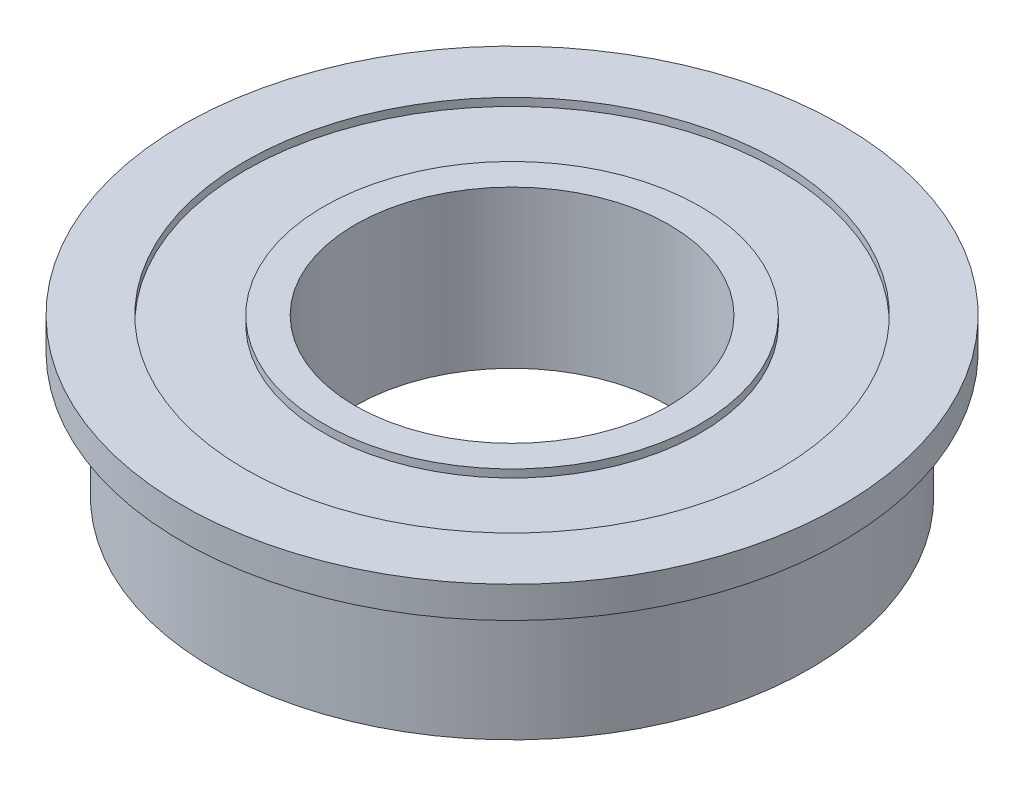
ISO-10303-21;
HEADER;
FILE_DESCRIPTION(('STEP AP214'),'2;1');
FILE_NAME('part.step','',(''),(''),'','','');
FILE_SCHEMA(('AUTOMOTIVE_DESIGN { 1 0 10303 214 1 1 1 1 }'));
ENDSEC;
DATA;
#1=APPLICATION_CONTEXT('core data for automotive mechanical design processes');
#2=APPLICATION_PROTOCOL_DEFINITION('international standard','automotive_design',2000,#1);
#3=PRODUCT_CONTEXT('',#1,'mechanical');
#4=PRODUCT('Part','Part','',(#3));
#5=PRODUCT_RELATED_PRODUCT_CATEGORY('part','',(#4));
#6=PRODUCT_DEFINITION_FORMATION('','',#4);
#7=PRODUCT_DEFINITION_CONTEXT('part definition',#1,'design');
#8=PRODUCT_DEFINITION('design','',#6,#7);
#9=PRODUCT_DEFINITION_SHAPE('','',#8);
#10=(LENGTH_UNIT() NAMED_UNIT(*) SI_UNIT(.MILLI.,.METRE.));
#11=(NAMED_UNIT(*) PLANE_ANGLE_UNIT() SI_UNIT($,.RADIAN.));
#12=(NAMED_UNIT(*) SI_UNIT($,.STERADIAN.) SOLID_ANGLE_UNIT());
#13=UNCERTAINTY_MEASURE_WITH_UNIT(LENGTH_MEASURE(1.E-05),#10,'distance_accuracy_value','');
#14=(GEOMETRIC_REPRESENTATION_CONTEXT(3) GLOBAL_UNCERTAINTY_ASSIGNED_CONTEXT((#13)) GLOBAL_UNIT_ASSIGNED_CONTEXT((#10,
#11,#12)) REPRESENTATION_CONTEXT('',''));
#15=CARTESIAN_POINT('',(0.,0.,0.));
#16=DIRECTION('',(0.,0.,1.));
#17=DIRECTION('',(1.,0.,0.));
#18=AXIS2_PLACEMENT_3D('',#15,#16,#17);
#19=CARTESIAN_POINT('',(5.,2.5,0.));
#20=DIRECTION('',(0.,1.,0.));
#21=DIRECTION('',(0.,0.,1.));
#22=AXIS2_PLACEMENT_3D('',#19,#20,#21);
#23=PLANE('',#22);
#24=CARTESIAN_POINT('',(0.,2.5,0.));
#25=DIRECTION('',(0.,-1.,0.));
#26=DIRECTION('',(0.,0.,-1.));
#27=AXIS2_PLACEMENT_3D('',#24,#25,#26);
#28=CIRCLE('',#27,5.);
#29=CARTESIAN_POINT('',(0.,2.5,-5.));
#30=VERTEX_POINT('',#29);
#31=EDGE_CURVE('E93',#30,#30,#28,.T.);
#32=ORIENTED_EDGE('',*,*,#31,.T.);
#33=EDGE_LOOP('',(#32));
#34=FACE_BOUND('',#33,.T.);
#35=CARTESIAN_POINT('',(0.,2.5,0.));
#36=DIRECTION('',(0.,-1.,0.));
#37=DIRECTION('',(0.,0.,-1.));
#38=AXIS2_PLACEMENT_3D('',#35,#36,#37);
#39=CIRCLE('',#38,6.);
#40=CARTESIAN_POINT('',(0.,2.5,-6.));
#41=VERTEX_POINT('',#40);
#42=EDGE_CURVE('E10',#41,#41,#39,.T.);
#43=ORIENTED_EDGE('',*,*,#42,.F.);
#44=EDGE_LOOP('',(#43));
#45=FACE_BOUND('',#44,.T.);
#46=ADVANCED_FACE('F44',(#34,#45),#23,.T.);
#47=CARTESIAN_POINT('',(0.,0.,0.));
#48=DIRECTION('',(0.,-1.,0.));
#49=DIRECTION('',(0.,0.,-1.));
#50=AXIS2_PLACEMENT_3D('',#47,#48,#49);
#51=CYLINDRICAL_SURFACE('',#50,6.);
#52=ORIENTED_EDGE('',*,*,#42,.T.);
#53=EDGE_LOOP('',(#52));
#54=FACE_BOUND('',#53,.T.);
#55=CARTESIAN_POINT('',(0.,2.25,0.));
#56=DIRECTION('',(0.,-1.,0.));
#57=DIRECTION('',(0.,0.,-1.));
#58=AXIS2_PLACEMENT_3D('',#55,#56,#57);
#59=CIRCLE('',#58,6.);
#60=CARTESIAN_POINT('',(0.,2.25,-6.));
#61=VERTEX_POINT('',#60);
#62=EDGE_CURVE('E51',#61,#61,#59,.T.);
#63=ORIENTED_EDGE('',*,*,#62,.F.);
#64=EDGE_LOOP('',(#63));
#65=FACE_BOUND('',#64,.T.);
#66=ADVANCED_FACE('F108',(#54,#65),#51,.T.);
#67=CARTESIAN_POINT('',(6.,2.25,0.));
#68=DIRECTION('',(0.,1.,0.));
#69=DIRECTION('',(0.,0.,1.));
#70=AXIS2_PLACEMENT_3D('',#67,#68,#69);
#71=PLANE('',#70);
#72=ORIENTED_EDGE('',*,*,#62,.T.);
#73=EDGE_LOOP('',(#72));
#74=FACE_BOUND('',#73,.T.);
#75=CARTESIAN_POINT('',(0.,2.25,0.));
#76=DIRECTION('',(0.,-1.,0.));
#77=DIRECTION('',(0.,0.,-1.));
#78=AXIS2_PLACEMENT_3D('',#75,#76,#77);
#79=CIRCLE('',#78,8.5);
#80=CARTESIAN_POINT('',(0.,2.25,-8.5));
#81=VERTEX_POINT('',#80);
#82=EDGE_CURVE('E54',#81,#81,#79,.T.);
#83=ORIENTED_EDGE('',*,*,#82,.F.);
#84=EDGE_LOOP('',(#83));
#85=FACE_BOUND('',#84,.T.);
#86=ADVANCED_FACE('F114',(#74,#85),#71,.T.);
#87=CARTESIAN_POINT('',(0.,0.,0.));
#88=DIRECTION('',(0.,-1.,0.));
#89=DIRECTION('',(0.,0.,-1.));
#90=AXIS2_PLACEMENT_3D('',#87,#88,#89);
#91=CYLINDRICAL_SURFACE('',#90,8.5);
#92=ORIENTED_EDGE('',*,*,#82,.T.);
#93=EDGE_LOOP('',(#92));
#94=FACE_BOUND('',#93,.T.);
#95=CARTESIAN_POINT('',(0.,2.5,0.));
#96=DIRECTION('',(0.,-1.,0.));
#97=DIRECTION('',(0.,0.,-1.));
#98=AXIS2_PLACEMENT_3D('',#95,#96,#97);
#99=CIRCLE('',#98,8.5);
#100=CARTESIAN_POINT('',(0.,2.5,-8.5));
#101=VERTEX_POINT('',#100);
#102=EDGE_CURVE('E56',#101,#101,#99,.T.);
#103=ORIENTED_EDGE('',*,*,#102,.F.);
#104=EDGE_LOOP('',(#103));
#105=FACE_BOUND('',#104,.T.);
#106=ADVANCED_FACE('F117',(#94,#105),#91,.F.);
#107=CARTESIAN_POINT('',(9.5,2.5,0.));
#108=DIRECTION('',(0.,1.,0.));
#109=DIRECTION('',(0.,0.,1.));
#110=AXIS2_PLACEMENT_3D('',#107,#108,#109);
#111=PLANE('',#110);
#112=ORIENTED_EDGE('',*,*,#102,.T.);
#113=EDGE_LOOP('',(#112));
#114=FACE_BOUND('',#113,.T.);
#115=CARTESIAN_POINT('',(0.,2.5,0.));
#116=DIRECTION('',(0.,-1.,0.));
#117=DIRECTION('',(0.,0.,-1.));
#118=AXIS2_PLACEMENT_3D('',#115,#116,#117);
#119=CIRCLE('',#118,10.5);
#120=CARTESIAN_POINT('',(0.,2.5,-10.5));
#121=VERTEX_POINT('',#120);
#122=EDGE_CURVE('E65',#121,#121,#119,.T.);
#123=ORIENTED_EDGE('',*,*,#122,.F.);
#124=EDGE_LOOP('',(#123));
#125=FACE_BOUND('',#124,.T.);
#126=ADVANCED_FACE('F121',(#114,#125),#111,.T.);
#127=CARTESIAN_POINT('',(0.,0.,0.));
#128=DIRECTION('',(0.,-1.,0.));
#129=DIRECTION('',(0.,0.,-1.));
#130=AXIS2_PLACEMENT_3D('',#127,#128,#129);
#131=CYLINDRICAL_SURFACE('',#130,10.5);
#132=ORIENTED_EDGE('',*,*,#122,.T.);
#133=EDGE_LOOP('',(#132));
#134=FACE_BOUND('',#133,.T.);
#135=CARTESIAN_POINT('',(0.,1.5,0.));
#136=DIRECTION('',(0.,-1.,0.));
#137=DIRECTION('',(0.,0.,-1.));
#138=AXIS2_PLACEMENT_3D('',#135,#136,#137);
#139=CIRCLE('',#138,10.5);
#140=CARTESIAN_POINT('',(0.,1.5,-10.5));
#141=VERTEX_POINT('',#140);
#142=EDGE_CURVE('E69',#141,#141,#139,.T.);
#143=ORIENTED_EDGE('',*,*,#142,.F.);
#144=EDGE_LOOP('',(#143));
#145=FACE_BOUND('',#144,.T.);
#146=ADVANCED_FACE('F126',(#134,#145),#131,.T.);
#147=CARTESIAN_POINT('',(10.5,1.5,0.));
#148=DIRECTION('',(0.,-1.,0.));
#149=DIRECTION('',(0.,0.,-1.));
#150=AXIS2_PLACEMENT_3D('',#147,#148,#149);
#151=PLANE('',#150);
#152=ORIENTED_EDGE('',*,*,#142,.T.);
#153=EDGE_LOOP('',(#152));
#154=FACE_BOUND('',#153,.T.);
#155=CARTESIAN_POINT('',(0.,1.5,0.));
#156=DIRECTION('',(0.,-1.,0.));
#157=DIRECTION('',(0.,0.,-1.));
#158=AXIS2_PLACEMENT_3D('',#155,#156,#157);
#159=CIRCLE('',#158,9.5);
#160=CARTESIAN_POINT('',(0.,1.5,-9.5));
#161=VERTEX_POINT('',#160);
#162=EDGE_CURVE('E68',#161,#161,#159,.T.);
#163=ORIENTED_EDGE('',*,*,#162,.F.);
#164=EDGE_LOOP('',(#163));
#165=FACE_BOUND('',#164,.T.);
#166=ADVANCED_FACE('F134',(#154,#165),#151,.T.);
#167=CARTESIAN_POINT('',(0.,0.,0.));
#168=DIRECTION('',(0.,-1.,0.));
#169=DIRECTION('',(0.,0.,-1.));
#170=AXIS2_PLACEMENT_3D('',#167,#168,#169);
#171=CYLINDRICAL_SURFACE('',#170,9.5);
#172=ORIENTED_EDGE('',*,*,#162,.T.);
#173=EDGE_LOOP('',(#172));
#174=FACE_BOUND('',#173,.T.);
#175=CARTESIAN_POINT('',(0.,-2.5,0.));
#176=DIRECTION('',(0.,-1.,0.));
#177=DIRECTION('',(0.,0.,-1.));
#178=AXIS2_PLACEMENT_3D('',#175,#176,#177);
#179=CIRCLE('',#178,9.5);
#180=CARTESIAN_POINT('',(0.,-2.5,-9.5));
#181=VERTEX_POINT('',#180);
#182=EDGE_CURVE('E71',#181,#181,#179,.T.);
#183=ORIENTED_EDGE('',*,*,#182,.F.);
#184=EDGE_LOOP('',(#183));
#185=FACE_BOUND('',#184,.T.);
#186=ADVANCED_FACE('F137',(#174,#185),#171,.T.);
#187=CARTESIAN_POINT('',(8.5,-2.5,0.));
#188=DIRECTION('',(0.,-1.,0.));
#189=DIRECTION('',(0.,0.,-1.));
#190=AXIS2_PLACEMENT_3D('',#187,#188,#189);
#191=PLANE('',#190);
#192=ORIENTED_EDGE('',*,*,#182,.T.);
#193=EDGE_LOOP('',(#192));
#194=FACE_BOUND('',#193,.T.);
#195=CARTESIAN_POINT('',(0.,-2.5,0.));
#196=DIRECTION('',(0.,-1.,0.));
#197=DIRECTION('',(0.,0.,-1.));
#198=AXIS2_PLACEMENT_3D('',#195,#196,#197);
#199=CIRCLE('',#198,8.5);
#200=CARTESIAN_POINT('',(0.,-2.5,-8.5));
#201=VERTEX_POINT('',#200);
#202=EDGE_CURVE('E78',#201,#201,#199,.T.);
#203=ORIENTED_EDGE('',*,*,#202,.F.);
#204=EDGE_LOOP('',(#203));
#205=FACE_BOUND('',#204,.T.);
#206=ADVANCED_FACE('F138',(#194,#205),#191,.T.);
#207=CARTESIAN_POINT('',(0.,0.,0.));
#208=DIRECTION('',(0.,-1.,0.));
#209=DIRECTION('',(0.,0.,-1.));
#210=AXIS2_PLACEMENT_3D('',#207,#208,#209);
#211=CYLINDRICAL_SURFACE('',#210,8.5);
#212=ORIENTED_EDGE('',*,*,#202,.T.);
#213=EDGE_LOOP('',(#212));
#214=FACE_BOUND('',#213,.T.);
#215=CARTESIAN_POINT('',(0.,-2.25,0.));
#216=DIRECTION('',(0.,-1.,0.));
#217=DIRECTION('',(0.,0.,-1.));
#218=AXIS2_PLACEMENT_3D('',#215,#216,#217);
#219=CIRCLE('',#218,8.5);
#220=CARTESIAN_POINT('',(0.,-2.25,-8.5));
#221=VERTEX_POINT('',#220);
#222=EDGE_CURVE('E80',#221,#221,#219,.T.);
#223=ORIENTED_EDGE('',*,*,#222,.F.);
#224=EDGE_LOOP('',(#223));
#225=FACE_BOUND('',#224,.T.);
#226=ADVANCED_FACE('F145',(#214,#225),#211,.F.);
#227=CARTESIAN_POINT('',(6.,-2.25,0.));
#228=DIRECTION('',(0.,-1.,0.));
#229=DIRECTION('',(0.,0.,-1.));
#230=AXIS2_PLACEMENT_3D('',#227,#228,#229);
#231=PLANE('',#230);
#232=ORIENTED_EDGE('',*,*,#222,.T.);
#233=EDGE_LOOP('',(#232));
#234=FACE_BOUND('',#233,.T.);
#235=CARTESIAN_POINT('',(0.,-2.25,0.));
#236=DIRECTION('',(0.,-1.,0.));
#237=DIRECTION('',(0.,0.,-1.));
#238=AXIS2_PLACEMENT_3D('',#235,#236,#237);
#239=CIRCLE('',#238,6.);
#240=CARTESIAN_POINT('',(0.,-2.25,-6.));
#241=VERTEX_POINT('',#240);
#242=EDGE_CURVE('E84',#241,#241,#239,.T.);
#243=ORIENTED_EDGE('',*,*,#242,.F.);
#244=EDGE_LOOP('',(#243));
#245=FACE_BOUND('',#244,.T.);
#246=ADVANCED_FACE('F146',(#234,#245),#231,.T.);
#247=CARTESIAN_POINT('',(0.,0.,0.));
#248=DIRECTION('',(0.,-1.,0.));
#249=DIRECTION('',(0.,0.,-1.));
#250=AXIS2_PLACEMENT_3D('',#247,#248,#249);
#251=CYLINDRICAL_SURFACE('',#250,6.);
#252=ORIENTED_EDGE('',*,*,#242,.T.);
#253=EDGE_LOOP('',(#252));
#254=FACE_BOUND('',#253,.T.);
#255=CARTESIAN_POINT('',(0.,-2.5,0.));
#256=DIRECTION('',(0.,-1.,0.));
#257=DIRECTION('',(0.,0.,-1.));
#258=AXIS2_PLACEMENT_3D('',#255,#256,#257);
#259=CIRCLE('',#258,6.);
#260=CARTESIAN_POINT('',(0.,-2.5,-6.));
#261=VERTEX_POINT('',#260);
#262=EDGE_CURVE('E83',#261,#261,#259,.T.);
#263=ORIENTED_EDGE('',*,*,#262,.F.);
#264=EDGE_LOOP('',(#263));
#265=FACE_BOUND('',#264,.T.);
#266=ADVANCED_FACE('F104',(#254,#265),#251,.T.);
#267=CARTESIAN_POINT('',(5.,-2.5,0.));
#268=DIRECTION('',(0.,-1.,0.));
#269=DIRECTION('',(0.,0.,-1.));
#270=AXIS2_PLACEMENT_3D('',#267,#268,#269);
#271=PLANE('',#270);
#272=ORIENTED_EDGE('',*,*,#262,.T.);
#273=EDGE_LOOP('',(#272));
#274=FACE_BOUND('',#273,.T.);
#275=CARTESIAN_POINT('',(0.,-2.5,0.));
#276=DIRECTION('',(0.,-1.,0.));
#277=DIRECTION('',(0.,0.,-1.));
#278=AXIS2_PLACEMENT_3D('',#275,#276,#277);
#279=CIRCLE('',#278,5.);
#280=CARTESIAN_POINT('',(0.,-2.5,-5.));
#281=VERTEX_POINT('',#280);
#282=EDGE_CURVE('E86',#281,#281,#279,.T.);
#283=ORIENTED_EDGE('',*,*,#282,.F.);
#284=EDGE_LOOP('',(#283));
#285=FACE_BOUND('',#284,.T.);
#286=ADVANCED_FACE('F97',(#274,#285),#271,.T.);
#287=CARTESIAN_POINT('',(0.,0.,0.));
#288=DIRECTION('',(0.,-1.,0.));
#289=DIRECTION('',(0.,0.,-1.));
#290=AXIS2_PLACEMENT_3D('',#287,#288,#289);
#291=CYLINDRICAL_SURFACE('',#290,5.);
#292=ORIENTED_EDGE('',*,*,#282,.T.);
#293=EDGE_LOOP('',(#292));
#294=FACE_BOUND('',#293,.T.);
#295=ORIENTED_EDGE('',*,*,#31,.F.);
#296=EDGE_LOOP('',(#295));
#297=FACE_BOUND('',#296,.T.);
#298=ADVANCED_FACE('F100',(#294,#297),#291,.F.);
#299=CLOSED_SHELL('',(#46,#66,#86,#106,#126,#146,#166,#186,#206,#226,#246,#266,#286,#298));
#300=MANIFOLD_SOLID_BREP('B2',#299);
#301=ADVANCED_BREP_SHAPE_REPRESENTATION('',(#18,#300),#14);
#302=SHAPE_DEFINITION_REPRESENTATION(#9,#301);
ENDSEC;
END-ISO-10303-21;
